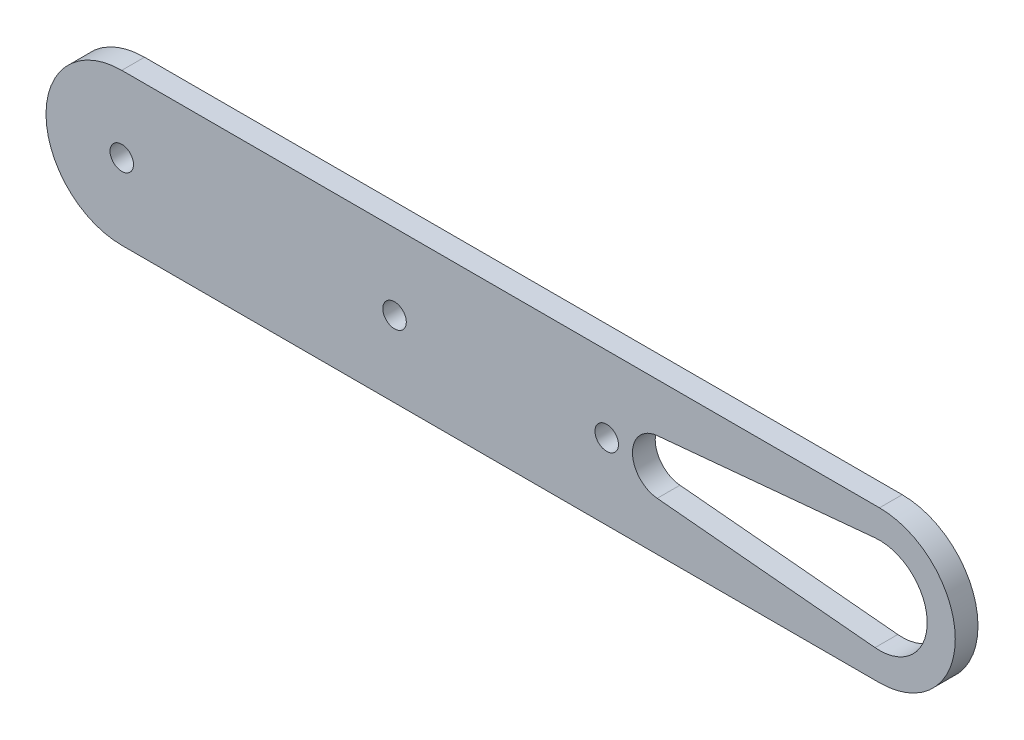
ISO-10303-21;
HEADER;
FILE_DESCRIPTION(('STEP AP214'),'2;1');
FILE_NAME('part.step','',(''),(''),'','','');
FILE_SCHEMA(('AUTOMOTIVE_DESIGN { 1 0 10303 214 1 1 1 1 }'));
ENDSEC;
DATA;
#1=APPLICATION_CONTEXT('core data for automotive mechanical design processes');
#2=APPLICATION_PROTOCOL_DEFINITION('international standard','automotive_design',2000,#1);
#3=PRODUCT_CONTEXT('',#1,'mechanical');
#4=PRODUCT('Part','Part','',(#3));
#5=PRODUCT_RELATED_PRODUCT_CATEGORY('part','',(#4));
#6=PRODUCT_DEFINITION_FORMATION('','',#4);
#7=PRODUCT_DEFINITION_CONTEXT('part definition',#1,'design');
#8=PRODUCT_DEFINITION('design','',#6,#7);
#9=PRODUCT_DEFINITION_SHAPE('','',#8);
#10=(LENGTH_UNIT() NAMED_UNIT(*) SI_UNIT(.MILLI.,.METRE.));
#11=(NAMED_UNIT(*) PLANE_ANGLE_UNIT() SI_UNIT($,.RADIAN.));
#12=(NAMED_UNIT(*) SI_UNIT($,.STERADIAN.) SOLID_ANGLE_UNIT());
#13=UNCERTAINTY_MEASURE_WITH_UNIT(LENGTH_MEASURE(1.E-05),#10,'distance_accuracy_value','');
#14=(GEOMETRIC_REPRESENTATION_CONTEXT(3) GLOBAL_UNCERTAINTY_ASSIGNED_CONTEXT((#13)) GLOBAL_UNIT_ASSIGNED_CONTEXT((#10,
#11,#12)) REPRESENTATION_CONTEXT('',''));
#15=CARTESIAN_POINT('',(0.,0.,0.));
#16=DIRECTION('',(0.,0.,1.));
#17=DIRECTION('',(1.,0.,0.));
#18=AXIS2_PLACEMENT_3D('',#15,#16,#17);
#19=CARTESIAN_POINT('',(-58.0586172408633,14.1910905170263,3.));
#20=DIRECTION('',(0.,0.,-1.));
#21=DIRECTION('',(-1.,0.,0.));
#22=AXIS2_PLACEMENT_3D('',#19,#20,#21);
#23=CYLINDRICAL_SURFACE('',#22,10.);
#24=CARTESIAN_POINT('',(-58.0586172408633,14.1910905170263,0.));
#25=DIRECTION('',(0.,0.,1.));
#26=DIRECTION('',(1.,0.,0.));
#27=AXIS2_PLACEMENT_3D('',#24,#25,#26);
#28=CIRCLE('',#27,10.);
#29=CARTESIAN_POINT('',(-58.0586172408633,24.1910905170263,0.));
#30=VERTEX_POINT('',#29);
#31=CARTESIAN_POINT('',(-58.0586172408633,4.19109051702633,0.));
#32=VERTEX_POINT('',#31);
#33=EDGE_CURVE('E178',#30,#32,#28,.T.);
#34=ORIENTED_EDGE('',*,*,#33,.T.);
#35=DIRECTION('',(0.,0.,-1.));
#36=VECTOR('',#35,1.);
#37=CARTESIAN_POINT('',(-58.0586172408633,4.19109051702633,3.));
#38=LINE('',#37,#36);
#39=CARTESIAN_POINT('',(-58.0586172408633,4.19109051702633,3.));
#40=VERTEX_POINT('',#39);
#41=EDGE_CURVE('E11',#40,#32,#38,.T.);
#42=ORIENTED_EDGE('',*,*,#41,.F.);
#43=CARTESIAN_POINT('',(-58.0586172408633,14.1910905170263,3.));
#44=DIRECTION('',(0.,0.,1.));
#45=DIRECTION('',(1.,0.,0.));
#46=AXIS2_PLACEMENT_3D('',#43,#44,#45);
#47=CIRCLE('',#46,10.);
#48=CARTESIAN_POINT('',(-58.0586172408633,24.1910905170263,3.));
#49=VERTEX_POINT('',#48);
#50=EDGE_CURVE('E182',#49,#40,#47,.T.);
#51=ORIENTED_EDGE('',*,*,#50,.F.);
#52=DIRECTION('',(0.,0.,-1.));
#53=VECTOR('',#52,1.);
#54=CARTESIAN_POINT('',(-58.0586172408633,24.1910905170263,3.));
#55=LINE('',#54,#53);
#56=EDGE_CURVE('E196',#49,#30,#55,.T.);
#57=ORIENTED_EDGE('',*,*,#56,.T.);
#58=EDGE_LOOP('',(#34,#42,#51,#57));
#59=FACE_BOUND('',#58,.T.);
#60=ADVANCED_FACE('F44',(#59),#23,.T.);
#61=CARTESIAN_POINT('',(-58.0586172408633,4.19109051702633,3.));
#62=DIRECTION('',(0.,1.,0.));
#63=DIRECTION('',(0.,0.,1.));
#64=AXIS2_PLACEMENT_3D('',#61,#62,#63);
#65=PLANE('',#64);
#66=DIRECTION('',(1.,0.,0.));
#67=VECTOR('',#66,1.);
#68=CARTESIAN_POINT('',(-58.0586172408633,4.19109051702633,0.));
#69=LINE('',#68,#67);
#70=CARTESIAN_POINT('',(41.9413827591368,4.19109051702633,0.));
#71=VERTEX_POINT('',#70);
#72=EDGE_CURVE('E200',#32,#71,#69,.T.);
#73=ORIENTED_EDGE('',*,*,#72,.T.);
#74=DIRECTION('',(0.,0.,-1.));
#75=VECTOR('',#74,1.);
#76=CARTESIAN_POINT('',(41.9413827591368,4.19109051702633,3.));
#77=LINE('',#76,#75);
#78=CARTESIAN_POINT('',(41.9413827591368,4.19109051702633,3.));
#79=VERTEX_POINT('',#78);
#80=EDGE_CURVE('E52',#79,#71,#77,.T.);
#81=ORIENTED_EDGE('',*,*,#80,.F.);
#82=DIRECTION('',(1.,0.,0.));
#83=VECTOR('',#82,1.);
#84=CARTESIAN_POINT('',(-58.0586172408633,4.19109051702633,3.));
#85=LINE('',#84,#83);
#86=EDGE_CURVE('E186',#40,#79,#85,.T.);
#87=ORIENTED_EDGE('',*,*,#86,.F.);
#88=ORIENTED_EDGE('',*,*,#41,.T.);
#89=EDGE_LOOP('',(#73,#81,#87,#88));
#90=FACE_BOUND('',#89,.T.);
#91=ADVANCED_FACE('F235',(#90),#65,.F.);
#92=CARTESIAN_POINT('',(41.9413827591368,14.1910905170263,3.));
#93=DIRECTION('',(0.,0.,-1.));
#94=DIRECTION('',(-1.,0.,0.));
#95=AXIS2_PLACEMENT_3D('',#92,#93,#94);
#96=CYLINDRICAL_SURFACE('',#95,10.);
#97=CARTESIAN_POINT('',(41.9413827591368,14.1910905170263,0.));
#98=DIRECTION('',(0.,0.,1.));
#99=DIRECTION('',(1.,0.,0.));
#100=AXIS2_PLACEMENT_3D('',#97,#98,#99);
#101=CIRCLE('',#100,10.);
#102=CARTESIAN_POINT('',(41.9413827591368,24.1910905170263,0.));
#103=VERTEX_POINT('',#102);
#104=EDGE_CURVE('E203',#71,#103,#101,.T.);
#105=ORIENTED_EDGE('',*,*,#104,.T.);
#106=DIRECTION('',(0.,0.,-1.));
#107=VECTOR('',#106,1.);
#108=CARTESIAN_POINT('',(41.9413827591368,24.1910905170263,3.));
#109=LINE('',#108,#107);
#110=CARTESIAN_POINT('',(41.9413827591368,24.1910905170263,3.));
#111=VERTEX_POINT('',#110);
#112=EDGE_CURVE('E211',#111,#103,#109,.T.);
#113=ORIENTED_EDGE('',*,*,#112,.F.);
#114=CARTESIAN_POINT('',(41.9413827591368,14.1910905170263,3.));
#115=DIRECTION('',(0.,0.,1.));
#116=DIRECTION('',(1.,0.,0.));
#117=AXIS2_PLACEMENT_3D('',#114,#115,#116);
#118=CIRCLE('',#117,10.);
#119=EDGE_CURVE('E190',#79,#111,#118,.T.);
#120=ORIENTED_EDGE('',*,*,#119,.F.);
#121=ORIENTED_EDGE('',*,*,#80,.T.);
#122=EDGE_LOOP('',(#105,#113,#120,#121));
#123=FACE_BOUND('',#122,.T.);
#124=ADVANCED_FACE('F220',(#123),#96,.T.);
#125=CARTESIAN_POINT('',(-58.0586172408633,24.1910905170263,3.));
#126=DIRECTION('',(0.,-1.,0.));
#127=DIRECTION('',(0.,0.,-1.));
#128=AXIS2_PLACEMENT_3D('',#125,#126,#127);
#129=PLANE('',#128);
#130=DIRECTION('',(-1.,0.,0.));
#131=VECTOR('',#130,1.);
#132=CARTESIAN_POINT('',(-58.0586172408633,24.1910905170263,0.));
#133=LINE('',#132,#131);
#134=EDGE_CURVE('E187',#103,#30,#133,.T.);
#135=ORIENTED_EDGE('',*,*,#134,.T.);
#136=ORIENTED_EDGE('',*,*,#56,.F.);
#137=DIRECTION('',(-1.,0.,0.));
#138=VECTOR('',#137,1.);
#139=CARTESIAN_POINT('',(-58.0586172408633,24.1910905170263,3.));
#140=LINE('',#139,#138);
#141=EDGE_CURVE('E193',#111,#49,#140,.T.);
#142=ORIENTED_EDGE('',*,*,#141,.F.);
#143=ORIENTED_EDGE('',*,*,#112,.T.);
#144=EDGE_LOOP('',(#135,#136,#142,#143));
#145=FACE_BOUND('',#144,.T.);
#146=ADVANCED_FACE('F228',(#145),#129,.F.);
#147=CARTESIAN_POINT('',(-58.0586172408633,14.1910905170263,3.));
#148=DIRECTION('',(0.,0.,1.));
#149=DIRECTION('',(1.,0.,0.));
#150=AXIS2_PLACEMENT_3D('',#147,#148,#149);
#151=PLANE('',#150);
#152=CARTESIAN_POINT('',(12.9413827591368,14.1910905170263,3.));
#153=DIRECTION('',(0.,0.,1.));
#154=DIRECTION('',(-1.,0.,0.));
#155=AXIS2_PLACEMENT_3D('',#152,#153,#154);
#156=CIRCLE('',#155,3.6);
#157=CARTESIAN_POINT('',(12.6062103453436,17.7754537035676,3.));
#158=VERTEX_POINT('',#157);
#159=CARTESIAN_POINT('',(12.6062103453436,10.6067273304851,3.));
#160=VERTEX_POINT('',#159);
#161=EDGE_CURVE('E59',#158,#160,#156,.T.);
#162=ORIENTED_EDGE('',*,*,#161,.F.);
#163=DIRECTION('',(-0.995656440705901,-0.0931034482758624,0.));
#164=VECTOR('',#163,1.);
#165=CARTESIAN_POINT('',(12.6062103453436,17.7754537035676,3.));
#166=LINE('',#165,#164);
#167=CARTESIAN_POINT('',(41.3548310349988,20.4637260934735,3.));
#168=VERTEX_POINT('',#167);
#169=EDGE_CURVE('E130',#168,#158,#166,.T.);
#170=ORIENTED_EDGE('',*,*,#169,.F.);
#171=CARTESIAN_POINT('',(41.9413827591368,14.1910905170263,3.));
#172=DIRECTION('',(0.,0.,1.));
#173=DIRECTION('',(-1.,0.,0.));
#174=AXIS2_PLACEMENT_3D('',#171,#172,#173);
#175=CIRCLE('',#174,6.3);
#176=CARTESIAN_POINT('',(41.3548310349988,7.91845494057915,3.));
#177=VERTEX_POINT('',#176);
#178=EDGE_CURVE('E134',#177,#168,#175,.T.);
#179=ORIENTED_EDGE('',*,*,#178,.F.);
#180=DIRECTION('',(0.995656440705901,-0.0931034482758622,0.));
#181=VECTOR('',#180,1.);
#182=CARTESIAN_POINT('',(41.3548310349988,7.91845494057916,3.));
#183=LINE('',#182,#181);
#184=EDGE_CURVE('E143',#160,#177,#183,.T.);
#185=ORIENTED_EDGE('',*,*,#184,.F.);
#186=EDGE_LOOP('',(#162,#170,#179,#185));
#187=FACE_BOUND('',#186,.T.);
#188=CARTESIAN_POINT('',(-22.0586172408633,14.1910905170263,3.));
#189=DIRECTION('',(0.,0.,-1.));
#190=DIRECTION('',(-1.,0.,0.));
#191=AXIS2_PLACEMENT_3D('',#188,#189,#190);
#192=CIRCLE('',#191,1.55);
#193=CARTESIAN_POINT('',(-23.6086172408633,14.1910905170263,3.));
#194=VERTEX_POINT('',#193);
#195=EDGE_CURVE('E158',#194,#194,#192,.T.);
#196=ORIENTED_EDGE('',*,*,#195,.T.);
#197=EDGE_LOOP('',(#196));
#198=FACE_BOUND('',#197,.T.);
#199=CARTESIAN_POINT('',(5.94138275913676,14.1910905170263,3.));
#200=DIRECTION('',(0.,0.,1.));
#201=DIRECTION('',(1.,0.,0.));
#202=AXIS2_PLACEMENT_3D('',#199,#200,#201);
#203=CIRCLE('',#202,1.55);
#204=CARTESIAN_POINT('',(7.49138275913676,14.1910905170263,3.));
#205=VERTEX_POINT('',#204);
#206=EDGE_CURVE('E162',#205,#205,#203,.T.);
#207=ORIENTED_EDGE('',*,*,#206,.F.);
#208=EDGE_LOOP('',(#207));
#209=FACE_BOUND('',#208,.T.);
#210=CARTESIAN_POINT('',(-58.0586172408633,14.1910905170263,3.));
#211=DIRECTION('',(0.,0.,1.));
#212=DIRECTION('',(1.,0.,0.));
#213=AXIS2_PLACEMENT_3D('',#210,#211,#212);
#214=CIRCLE('',#213,1.55);
#215=CARTESIAN_POINT('',(-56.5086172408633,14.1910905170263,3.));
#216=VERTEX_POINT('',#215);
#217=EDGE_CURVE('E170',#216,#216,#214,.T.);
#218=ORIENTED_EDGE('',*,*,#217,.F.);
#219=EDGE_LOOP('',(#218));
#220=FACE_BOUND('',#219,.T.);
#221=ORIENTED_EDGE('',*,*,#50,.T.);
#222=ORIENTED_EDGE('',*,*,#86,.T.);
#223=ORIENTED_EDGE('',*,*,#119,.T.);
#224=ORIENTED_EDGE('',*,*,#141,.T.);
#225=EDGE_LOOP('',(#221,#222,#223,#224));
#226=FACE_BOUND('',#225,.T.);
#227=ADVANCED_FACE('F234',(#187,#198,#209,#220,#226),#151,.T.);
#228=CARTESIAN_POINT('',(-58.0586172408633,14.1910905170263,0.));
#229=DIRECTION('',(0.,0.,1.));
#230=DIRECTION('',(1.,0.,0.));
#231=AXIS2_PLACEMENT_3D('',#228,#229,#230);
#232=PLANE('',#231);
#233=DIRECTION('',(-0.995656440705901,-0.0931034482758624,0.));
#234=VECTOR('',#233,1.);
#235=CARTESIAN_POINT('',(12.6062103453436,17.7754537035676,0.));
#236=LINE('',#235,#234);
#237=CARTESIAN_POINT('',(41.3548310349988,20.4637260934735,0.));
#238=VERTEX_POINT('',#237);
#239=CARTESIAN_POINT('',(12.6062103453436,17.7754537035676,0.));
#240=VERTEX_POINT('',#239);
#241=EDGE_CURVE('E118',#238,#240,#236,.T.);
#242=ORIENTED_EDGE('',*,*,#241,.T.);
#243=CARTESIAN_POINT('',(12.9413827591368,14.1910905170263,0.));
#244=DIRECTION('',(0.,0.,1.));
#245=DIRECTION('',(-1.,0.,0.));
#246=AXIS2_PLACEMENT_3D('',#243,#244,#245);
#247=CIRCLE('',#246,3.6);
#248=CARTESIAN_POINT('',(12.6062103453437,10.6067273304851,0.));
#249=VERTEX_POINT('',#248);
#250=EDGE_CURVE('E111',#240,#249,#247,.T.);
#251=ORIENTED_EDGE('',*,*,#250,.T.);
#252=DIRECTION('',(0.995656440705901,-0.0931034482758622,0.));
#253=VECTOR('',#252,1.);
#254=CARTESIAN_POINT('',(41.3548310349988,7.91845494057916,0.));
#255=LINE('',#254,#253);
#256=CARTESIAN_POINT('',(41.3548310349988,7.91845494057916,0.));
#257=VERTEX_POINT('',#256);
#258=EDGE_CURVE('E121',#249,#257,#255,.T.);
#259=ORIENTED_EDGE('',*,*,#258,.T.);
#260=CARTESIAN_POINT('',(41.9413827591368,14.1910905170263,0.));
#261=DIRECTION('',(0.,0.,1.));
#262=DIRECTION('',(-1.,0.,0.));
#263=AXIS2_PLACEMENT_3D('',#260,#261,#262);
#264=CIRCLE('',#263,6.3);
#265=EDGE_CURVE('E67',#257,#238,#264,.T.);
#266=ORIENTED_EDGE('',*,*,#265,.T.);
#267=EDGE_LOOP('',(#242,#251,#259,#266));
#268=FACE_BOUND('',#267,.T.);
#269=CARTESIAN_POINT('',(-22.0586172408633,14.1910905170263,0.));
#270=DIRECTION('',(0.,0.,-1.));
#271=DIRECTION('',(-1.,0.,0.));
#272=AXIS2_PLACEMENT_3D('',#269,#270,#271);
#273=CIRCLE('',#272,1.55);
#274=CARTESIAN_POINT('',(-23.6086172408633,14.1910905170263,0.));
#275=VERTEX_POINT('',#274);
#276=EDGE_CURVE('E152',#275,#275,#273,.T.);
#277=ORIENTED_EDGE('',*,*,#276,.F.);
#278=EDGE_LOOP('',(#277));
#279=FACE_BOUND('',#278,.T.);
#280=CARTESIAN_POINT('',(5.94138275913676,14.1910905170263,0.));
#281=DIRECTION('',(0.,0.,1.));
#282=DIRECTION('',(1.,0.,0.));
#283=AXIS2_PLACEMENT_3D('',#280,#281,#282);
#284=CIRCLE('',#283,1.55);
#285=CARTESIAN_POINT('',(7.49138275913676,14.1910905170263,0.));
#286=VERTEX_POINT('',#285);
#287=EDGE_CURVE('E166',#286,#286,#284,.T.);
#288=ORIENTED_EDGE('',*,*,#287,.T.);
#289=EDGE_LOOP('',(#288));
#290=FACE_BOUND('',#289,.T.);
#291=CARTESIAN_POINT('',(-58.0586172408633,14.1910905170263,0.));
#292=DIRECTION('',(0.,0.,1.));
#293=DIRECTION('',(1.,0.,0.));
#294=AXIS2_PLACEMENT_3D('',#291,#292,#293);
#295=CIRCLE('',#294,1.55);
#296=CARTESIAN_POINT('',(-56.5086172408633,14.1910905170263,0.));
#297=VERTEX_POINT('',#296);
#298=EDGE_CURVE('E174',#297,#297,#295,.T.);
#299=ORIENTED_EDGE('',*,*,#298,.T.);
#300=EDGE_LOOP('',(#299));
#301=FACE_BOUND('',#300,.T.);
#302=ORIENTED_EDGE('',*,*,#33,.F.);
#303=ORIENTED_EDGE('',*,*,#134,.F.);
#304=ORIENTED_EDGE('',*,*,#104,.F.);
#305=ORIENTED_EDGE('',*,*,#72,.F.);
#306=EDGE_LOOP('',(#302,#303,#304,#305));
#307=FACE_BOUND('',#306,.T.);
#308=ADVANCED_FACE('F126',(#268,#279,#290,#301,#307),#232,.F.);
#309=CARTESIAN_POINT('',(-58.0586172408633,14.1910905170263,0.));
#310=DIRECTION('',(0.,0.,1.));
#311=DIRECTION('',(1.,0.,0.));
#312=AXIS2_PLACEMENT_3D('',#309,#310,#311);
#313=CYLINDRICAL_SURFACE('',#312,1.55);
#314=ORIENTED_EDGE('',*,*,#298,.F.);
#315=EDGE_LOOP('',(#314));
#316=FACE_BOUND('',#315,.T.);
#317=ORIENTED_EDGE('',*,*,#217,.T.);
#318=EDGE_LOOP('',(#317));
#319=FACE_BOUND('',#318,.T.);
#320=ADVANCED_FACE('F247',(#316,#319),#313,.F.);
#321=CARTESIAN_POINT('',(5.94138275913676,14.1910905170263,0.));
#322=DIRECTION('',(0.,0.,1.));
#323=DIRECTION('',(1.,0.,0.));
#324=AXIS2_PLACEMENT_3D('',#321,#322,#323);
#325=CYLINDRICAL_SURFACE('',#324,1.55);
#326=ORIENTED_EDGE('',*,*,#287,.F.);
#327=EDGE_LOOP('',(#326));
#328=FACE_BOUND('',#327,.T.);
#329=ORIENTED_EDGE('',*,*,#206,.T.);
#330=EDGE_LOOP('',(#329));
#331=FACE_BOUND('',#330,.T.);
#332=ADVANCED_FACE('F253',(#328,#331),#325,.F.);
#333=CARTESIAN_POINT('',(-22.0586172408633,14.1910905170263,3.));
#334=DIRECTION('',(0.,0.,-1.));
#335=DIRECTION('',(-1.,0.,0.));
#336=AXIS2_PLACEMENT_3D('',#333,#334,#335);
#337=CYLINDRICAL_SURFACE('',#336,1.55);
#338=ORIENTED_EDGE('',*,*,#195,.F.);
#339=EDGE_LOOP('',(#338));
#340=FACE_BOUND('',#339,.T.);
#341=ORIENTED_EDGE('',*,*,#276,.T.);
#342=EDGE_LOOP('',(#341));
#343=FACE_BOUND('',#342,.T.);
#344=ADVANCED_FACE('F257',(#340,#343),#337,.F.);
#345=CARTESIAN_POINT('',(12.9413827591368,14.1910905170263,0.));
#346=DIRECTION('',(0.,0.,1.));
#347=DIRECTION('',(1.,0.,0.));
#348=AXIS2_PLACEMENT_3D('',#345,#346,#347);
#349=CYLINDRICAL_SURFACE('',#348,3.6);
#350=ORIENTED_EDGE('',*,*,#161,.T.);
#351=DIRECTION('',(0.,0.,1.));
#352=VECTOR('',#351,1.);
#353=CARTESIAN_POINT('',(12.6062103453437,10.6067273304851,0.));
#354=LINE('',#353,#352);
#355=EDGE_CURVE('E107',#249,#160,#354,.T.);
#356=ORIENTED_EDGE('',*,*,#355,.F.);
#357=ORIENTED_EDGE('',*,*,#250,.F.);
#358=DIRECTION('',(0.,0.,1.));
#359=VECTOR('',#358,1.);
#360=CARTESIAN_POINT('',(12.6062103453436,17.7754537035676,0.));
#361=LINE('',#360,#359);
#362=EDGE_CURVE('E149',#240,#158,#361,.T.);
#363=ORIENTED_EDGE('',*,*,#362,.T.);
#364=EDGE_LOOP('',(#350,#356,#357,#363));
#365=FACE_BOUND('',#364,.T.);
#366=ADVANCED_FACE('F109',(#365),#349,.F.);
#367=CARTESIAN_POINT('',(12.6062103453436,17.7754537035676,0.));
#368=DIRECTION('',(-0.0931034482758624,0.995656440705901,0.));
#369=DIRECTION('',(-0.995656440705901,-0.0931034482758624,0.));
#370=AXIS2_PLACEMENT_3D('',#367,#368,#369);
#371=PLANE('',#370);
#372=ORIENTED_EDGE('',*,*,#169,.T.);
#373=ORIENTED_EDGE('',*,*,#362,.F.);
#374=ORIENTED_EDGE('',*,*,#241,.F.);
#375=DIRECTION('',(0.,0.,1.));
#376=VECTOR('',#375,1.);
#377=CARTESIAN_POINT('',(41.3548310349988,20.4637260934735,0.));
#378=LINE('',#377,#376);
#379=EDGE_CURVE('E153',#238,#168,#378,.T.);
#380=ORIENTED_EDGE('',*,*,#379,.T.);
#381=EDGE_LOOP('',(#372,#373,#374,#380));
#382=FACE_BOUND('',#381,.T.);
#383=ADVANCED_FACE('F264',(#382),#371,.F.);
#384=CARTESIAN_POINT('',(41.9413827591368,14.1910905170263,0.));
#385=DIRECTION('',(0.,0.,1.));
#386=DIRECTION('',(1.,0.,0.));
#387=AXIS2_PLACEMENT_3D('',#384,#385,#386);
#388=CYLINDRICAL_SURFACE('',#387,6.3);
#389=ORIENTED_EDGE('',*,*,#178,.T.);
#390=ORIENTED_EDGE('',*,*,#379,.F.);
#391=ORIENTED_EDGE('',*,*,#265,.F.);
#392=DIRECTION('',(0.,0.,1.));
#393=VECTOR('',#392,1.);
#394=CARTESIAN_POINT('',(41.3548310349988,7.91845494057915,0.));
#395=LINE('',#394,#393);
#396=EDGE_CURVE('E117',#257,#177,#395,.T.);
#397=ORIENTED_EDGE('',*,*,#396,.T.);
#398=EDGE_LOOP('',(#389,#390,#391,#397));
#399=FACE_BOUND('',#398,.T.);
#400=ADVANCED_FACE('F267',(#399),#388,.F.);
#401=CARTESIAN_POINT('',(41.3548310349988,7.91845494057916,0.));
#402=DIRECTION('',(-0.0931034482758622,-0.995656440705901,0.));
#403=DIRECTION('',(0.995656440705901,-0.0931034482758622,0.));
#404=AXIS2_PLACEMENT_3D('',#401,#402,#403);
#405=PLANE('',#404);
#406=ORIENTED_EDGE('',*,*,#184,.T.);
#407=ORIENTED_EDGE('',*,*,#396,.F.);
#408=ORIENTED_EDGE('',*,*,#258,.F.);
#409=ORIENTED_EDGE('',*,*,#355,.T.);
#410=EDGE_LOOP('',(#406,#407,#408,#409));
#411=FACE_BOUND('',#410,.T.);
#412=ADVANCED_FACE('F122',(#411),#405,.F.);
#413=CLOSED_SHELL('',(#60,#91,#124,#146,#227,#308,#320,#332,#344,#366,#383,#400,#412));
#414=MANIFOLD_SOLID_BREP('B2',#413);
#415=ADVANCED_BREP_SHAPE_REPRESENTATION('',(#18,#414),#14);
#416=SHAPE_DEFINITION_REPRESENTATION(#9,#415);
ENDSEC;
END-ISO-10303-21;
